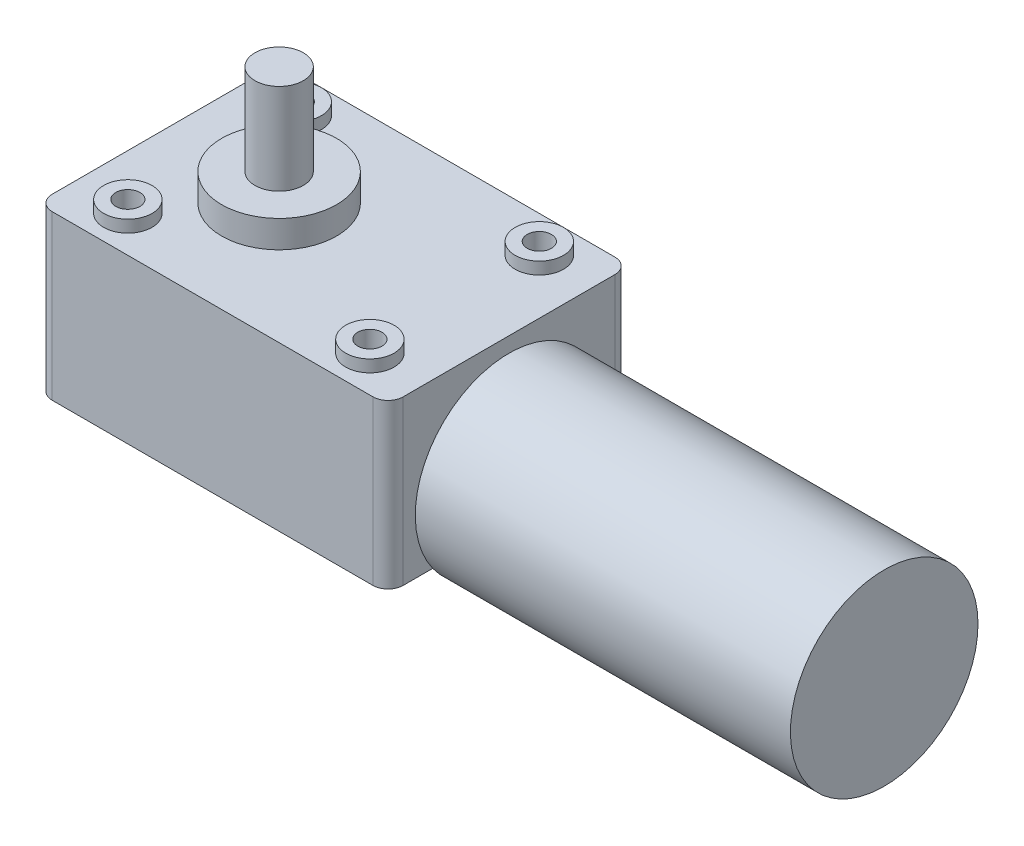
ISO-10303-21;
HEADER;
FILE_DESCRIPTION(('STEP AP214'),'2;1');
FILE_NAME('part.step','',(''),(''),'','','');
FILE_SCHEMA(('AUTOMOTIVE_DESIGN { 1 0 10303 214 1 1 1 1 }'));
ENDSEC;
DATA;
#1=APPLICATION_CONTEXT('core data for automotive mechanical design processes');
#2=APPLICATION_PROTOCOL_DEFINITION('international standard','automotive_design',2000,#1);
#3=PRODUCT_CONTEXT('',#1,'mechanical');
#4=PRODUCT('Part','Part','',(#3));
#5=PRODUCT_RELATED_PRODUCT_CATEGORY('part','',(#4));
#6=PRODUCT_DEFINITION_FORMATION('','',#4);
#7=PRODUCT_DEFINITION_CONTEXT('part definition',#1,'design');
#8=PRODUCT_DEFINITION('design','',#6,#7);
#9=PRODUCT_DEFINITION_SHAPE('','',#8);
#10=(LENGTH_UNIT() NAMED_UNIT(*) SI_UNIT(.MILLI.,.METRE.));
#11=(NAMED_UNIT(*) PLANE_ANGLE_UNIT() SI_UNIT($,.RADIAN.));
#12=(NAMED_UNIT(*) SI_UNIT($,.STERADIAN.) SOLID_ANGLE_UNIT());
#13=UNCERTAINTY_MEASURE_WITH_UNIT(LENGTH_MEASURE(1.E-05),#10,'distance_accuracy_value','');
#14=(GEOMETRIC_REPRESENTATION_CONTEXT(3) GLOBAL_UNCERTAINTY_ASSIGNED_CONTEXT((#13)) GLOBAL_UNIT_ASSIGNED_CONTEXT((#10,
#11,#12)) REPRESENTATION_CONTEXT('',''));
#15=CARTESIAN_POINT('',(0.,0.,0.));
#16=DIRECTION('',(0.,0.,1.));
#17=DIRECTION('',(1.,0.,0.));
#18=AXIS2_PLACEMENT_3D('',#15,#16,#17);
#19=CARTESIAN_POINT('',(-20.,-15.5,14.));
#20=DIRECTION('',(0.,-1.,0.));
#21=DIRECTION('',(0.,0.,1.));
#22=AXIS2_PLACEMENT_3D('',#19,#20,#21);
#23=PLANE('',#22);
#24=CARTESIAN_POINT('',(-20.,-15.5,14.));
#25=DIRECTION('',(0.,1.,0.));
#26=DIRECTION('',(0.,0.,1.));
#27=AXIS2_PLACEMENT_3D('',#24,#25,#26);
#28=CIRCLE('',#27,4.);
#29=CARTESIAN_POINT('',(-20.,-15.5,18.));
#30=VERTEX_POINT('',#29);
#31=EDGE_CURVE('E812',#30,#30,#28,.T.);
#32=ORIENTED_EDGE('',*,*,#31,.F.);
#33=EDGE_LOOP('',(#32));
#34=FACE_BOUND('',#33,.T.);
#35=CARTESIAN_POINT('',(-20.,-15.5,14.));
#36=DIRECTION('',(0.,1.,0.));
#37=DIRECTION('',(0.,0.,1.));
#38=AXIS2_PLACEMENT_3D('',#35,#36,#37);
#39=CIRCLE('',#38,2.);
#40=CARTESIAN_POINT('',(-20.,-15.5,16.));
#41=VERTEX_POINT('',#40);
#42=EDGE_CURVE('E840',#41,#41,#39,.T.);
#43=ORIENTED_EDGE('',*,*,#42,.T.);
#44=EDGE_LOOP('',(#43));
#45=FACE_BOUND('',#44,.T.);
#46=ADVANCED_FACE('F34',(#34,#45),#23,.T.);
#47=CARTESIAN_POINT('',(20.,-15.5,14.));
#48=DIRECTION('',(0.,-1.,0.));
#49=DIRECTION('',(0.,0.,1.));
#50=AXIS2_PLACEMENT_3D('',#47,#48,#49);
#51=PLANE('',#50);
#52=CARTESIAN_POINT('',(20.,-15.5,14.));
#53=DIRECTION('',(0.,1.,0.));
#54=DIRECTION('',(0.,0.,1.));
#55=AXIS2_PLACEMENT_3D('',#52,#53,#54);
#56=CIRCLE('',#55,4.);
#57=CARTESIAN_POINT('',(20.,-15.5,18.));
#58=VERTEX_POINT('',#57);
#59=EDGE_CURVE('E806',#58,#58,#56,.T.);
#60=ORIENTED_EDGE('',*,*,#59,.F.);
#61=EDGE_LOOP('',(#60));
#62=FACE_BOUND('',#61,.T.);
#63=CARTESIAN_POINT('',(20.,-15.5,14.));
#64=DIRECTION('',(0.,1.,0.));
#65=DIRECTION('',(0.,0.,1.));
#66=AXIS2_PLACEMENT_3D('',#63,#64,#65);
#67=CIRCLE('',#66,2.);
#68=CARTESIAN_POINT('',(20.,-15.5,16.));
#69=VERTEX_POINT('',#68);
#70=EDGE_CURVE('E792',#69,#69,#67,.T.);
#71=ORIENTED_EDGE('',*,*,#70,.T.);
#72=EDGE_LOOP('',(#71));
#73=FACE_BOUND('',#72,.T.);
#74=ADVANCED_FACE('F276',(#62,#73),#51,.T.);
#75=CARTESIAN_POINT('',(20.,-15.5,-14.));
#76=DIRECTION('',(0.,-1.,0.));
#77=DIRECTION('',(0.,0.,1.));
#78=AXIS2_PLACEMENT_3D('',#75,#76,#77);
#79=PLANE('',#78);
#80=CARTESIAN_POINT('',(20.,-15.5,-14.));
#81=DIRECTION('',(0.,1.,0.));
#82=DIRECTION('',(0.,0.,1.));
#83=AXIS2_PLACEMENT_3D('',#80,#81,#82);
#84=CIRCLE('',#83,4.);
#85=CARTESIAN_POINT('',(20.,-15.5,-10.));
#86=VERTEX_POINT('',#85);
#87=EDGE_CURVE('E780',#86,#86,#84,.T.);
#88=ORIENTED_EDGE('',*,*,#87,.F.);
#89=EDGE_LOOP('',(#88));
#90=FACE_BOUND('',#89,.T.);
#91=CARTESIAN_POINT('',(20.,-15.5,-14.));
#92=DIRECTION('',(0.,1.,0.));
#93=DIRECTION('',(0.,0.,1.));
#94=AXIS2_PLACEMENT_3D('',#91,#92,#93);
#95=CIRCLE('',#94,2.);
#96=CARTESIAN_POINT('',(20.,-15.5,-12.));
#97=VERTEX_POINT('',#96);
#98=EDGE_CURVE('E783',#97,#97,#95,.T.);
#99=ORIENTED_EDGE('',*,*,#98,.T.);
#100=EDGE_LOOP('',(#99));
#101=FACE_BOUND('',#100,.T.);
#102=ADVANCED_FACE('F282',(#90,#101),#79,.T.);
#103=CARTESIAN_POINT('',(-20.,-15.5,-13.9999999999999));
#104=DIRECTION('',(0.,-1.,0.));
#105=DIRECTION('',(0.,0.,1.));
#106=AXIS2_PLACEMENT_3D('',#103,#104,#105);
#107=PLANE('',#106);
#108=CARTESIAN_POINT('',(-20.,-15.5,-13.9999999999999));
#109=DIRECTION('',(0.,1.,0.));
#110=DIRECTION('',(0.,0.,1.));
#111=AXIS2_PLACEMENT_3D('',#108,#109,#110);
#112=CIRCLE('',#111,4.);
#113=CARTESIAN_POINT('',(-20.,-15.5,-9.9999999999999));
#114=VERTEX_POINT('',#113);
#115=EDGE_CURVE('E188',#114,#114,#112,.T.);
#116=ORIENTED_EDGE('',*,*,#115,.F.);
#117=EDGE_LOOP('',(#116));
#118=FACE_BOUND('',#117,.T.);
#119=CARTESIAN_POINT('',(-20.,-15.5,-13.9999999999999));
#120=DIRECTION('',(0.,1.,0.));
#121=DIRECTION('',(0.,0.,1.));
#122=AXIS2_PLACEMENT_3D('',#119,#120,#121);
#123=CIRCLE('',#122,2.);
#124=CARTESIAN_POINT('',(-20.,-15.5,-11.9999999999999));
#125=VERTEX_POINT('',#124);
#126=EDGE_CURVE('E789',#125,#125,#123,.T.);
#127=ORIENTED_EDGE('',*,*,#126,.T.);
#128=EDGE_LOOP('',(#127));
#129=FACE_BOUND('',#128,.T.);
#130=ADVANCED_FACE('F295',(#118,#129),#107,.T.);
#131=CARTESIAN_POINT('',(29.,13.5,17.5));
#132=DIRECTION('',(-1.,0.,0.));
#133=DIRECTION('',(0.,0.,1.));
#134=AXIS2_PLACEMENT_3D('',#131,#132,#133);
#135=PLANE('',#134);
#136=CARTESIAN_POINT('',(29.,-4.49999999999995,0.));
#137=DIRECTION('',(1.,0.,0.));
#138=DIRECTION('',(0.,0.,-1.));
#139=AXIS2_PLACEMENT_3D('',#136,#137,#138);
#140=CIRCLE('',#139,15.5);
#141=CARTESIAN_POINT('',(29.,-13.5,-12.6194294641239));
#142=VERTEX_POINT('',#141);
#143=CARTESIAN_POINT('',(29.,-13.5,12.6194294641239));
#144=VERTEX_POINT('',#143);
#145=EDGE_CURVE('E181',#142,#144,#140,.T.);
#146=ORIENTED_EDGE('',*,*,#145,.F.);
#147=DIRECTION('',(0.,0.,-1.));
#148=VECTOR('',#147,1.);
#149=CARTESIAN_POINT('',(29.,-13.5,17.5));
#150=LINE('',#149,#148);
#151=CARTESIAN_POINT('',(29.,-13.5,-17.5));
#152=VERTEX_POINT('',#151);
#153=EDGE_CURVE('E150',#142,#152,#150,.T.);
#154=ORIENTED_EDGE('',*,*,#153,.T.);
#155=DIRECTION('',(0.,-1.,0.));
#156=VECTOR('',#155,1.);
#157=CARTESIAN_POINT('',(29.,13.5,-17.5));
#158=LINE('',#157,#156);
#159=CARTESIAN_POINT('',(29.,13.5,-17.5));
#160=VERTEX_POINT('',#159);
#161=EDGE_CURVE('E163',#160,#152,#158,.T.);
#162=ORIENTED_EDGE('',*,*,#161,.F.);
#163=DIRECTION('',(0.,0.,-1.));
#164=VECTOR('',#163,1.);
#165=CARTESIAN_POINT('',(29.,13.5,17.5));
#166=LINE('',#165,#164);
#167=CARTESIAN_POINT('',(29.,13.5,17.5));
#168=VERTEX_POINT('',#167);
#169=EDGE_CURVE('E259',#168,#160,#166,.T.);
#170=ORIENTED_EDGE('',*,*,#169,.F.);
#171=DIRECTION('',(0.,-1.,0.));
#172=VECTOR('',#171,1.);
#173=CARTESIAN_POINT('',(29.,13.5,17.5));
#174=LINE('',#173,#172);
#175=CARTESIAN_POINT('',(29.,-13.5,17.5));
#176=VERTEX_POINT('',#175);
#177=EDGE_CURVE('E166',#168,#176,#174,.T.);
#178=ORIENTED_EDGE('',*,*,#177,.T.);
#179=EDGE_CURVE('E151',#176,#144,#150,.T.);
#180=ORIENTED_EDGE('',*,*,#179,.T.);
#181=EDGE_LOOP('',(#146,#154,#162,#170,#178,#180));
#182=FACE_BOUND('',#181,.T.);
#183=ADVANCED_FACE('F180',(#182),#135,.F.);
#184=CARTESIAN_POINT('',(-9.00000000000001,18.,0.));
#185=DIRECTION('',(0.,1.,0.));
#186=DIRECTION('',(0.,0.,1.));
#187=AXIS2_PLACEMENT_3D('',#184,#185,#186);
#188=PLANE('',#187);
#189=CARTESIAN_POINT('',(-9.00000000000001,18.,0.));
#190=DIRECTION('',(0.,1.,0.));
#191=DIRECTION('',(0.,0.,1.));
#192=AXIS2_PLACEMENT_3D('',#189,#190,#191);
#193=CIRCLE('',#192,9.5);
#194=CARTESIAN_POINT('',(-9.00000000000001,18.,9.5));
#195=VERTEX_POINT('',#194);
#196=EDGE_CURVE('E204',#195,#195,#193,.T.);
#197=ORIENTED_EDGE('',*,*,#196,.T.);
#198=EDGE_LOOP('',(#197));
#199=FACE_BOUND('',#198,.T.);
#200=CARTESIAN_POINT('',(-9.00000000000001,18.,0.));
#201=DIRECTION('',(0.,1.,0.));
#202=DIRECTION('',(0.,0.,1.));
#203=AXIS2_PLACEMENT_3D('',#200,#201,#202);
#204=CIRCLE('',#203,4.);
#205=CARTESIAN_POINT('',(-9.00000000000001,18.,4.));
#206=VERTEX_POINT('',#205);
#207=EDGE_CURVE('E194',#206,#206,#204,.T.);
#208=ORIENTED_EDGE('',*,*,#207,.F.);
#209=EDGE_LOOP('',(#208));
#210=FACE_BOUND('',#209,.T.);
#211=ADVANCED_FACE('F320',(#199,#210),#188,.T.);
#212=CARTESIAN_POINT('',(-26.5,13.5,17.5));
#213=DIRECTION('',(0.,1.,0.));
#214=DIRECTION('',(0.,0.,1.));
#215=AXIS2_PLACEMENT_3D('',#212,#213,#214);
#216=PLANE('',#215);
#217=CARTESIAN_POINT('',(20.,13.5,-14.));
#218=DIRECTION('',(0.,1.,0.));
#219=DIRECTION('',(0.,0.,1.));
#220=AXIS2_PLACEMENT_3D('',#217,#218,#219);
#221=CIRCLE('',#220,4.);
#222=CARTESIAN_POINT('',(20.,13.5,-10.));
#223=VERTEX_POINT('',#222);
#224=EDGE_CURVE('E231',#223,#223,#221,.T.);
#225=ORIENTED_EDGE('',*,*,#224,.F.);
#226=EDGE_LOOP('',(#225));
#227=FACE_BOUND('',#226,.T.);
#228=CARTESIAN_POINT('',(-20.,13.5,14.));
#229=DIRECTION('',(0.,1.,0.));
#230=DIRECTION('',(0.,0.,1.));
#231=AXIS2_PLACEMENT_3D('',#228,#229,#230);
#232=CIRCLE('',#231,4.);
#233=CARTESIAN_POINT('',(-20.,13.5,18.));
#234=VERTEX_POINT('',#233);
#235=EDGE_CURVE('E243',#234,#234,#232,.T.);
#236=ORIENTED_EDGE('',*,*,#235,.F.);
#237=EDGE_LOOP('',(#236));
#238=FACE_BOUND('',#237,.T.);
#239=CARTESIAN_POINT('',(-26.5,13.5,17.5));
#240=DIRECTION('',(0.,1.,0.));
#241=DIRECTION('',(0.,0.,1.));
#242=AXIS2_PLACEMENT_3D('',#239,#240,#241);
#243=CIRCLE('',#242,2.5);
#244=CARTESIAN_POINT('',(-29.,13.5,17.5));
#245=VERTEX_POINT('',#244);
#246=CARTESIAN_POINT('',(-26.5,13.5,20.));
#247=VERTEX_POINT('',#246);
#248=EDGE_CURVE('E159',#245,#247,#243,.T.);
#249=ORIENTED_EDGE('',*,*,#248,.T.);
#250=DIRECTION('',(1.,0.,0.));
#251=VECTOR('',#250,1.);
#252=CARTESIAN_POINT('',(-26.5,13.5,20.));
#253=LINE('',#252,#251);
#254=CARTESIAN_POINT('',(26.5,13.5,20.));
#255=VERTEX_POINT('',#254);
#256=EDGE_CURVE('E99',#247,#255,#253,.T.);
#257=ORIENTED_EDGE('',*,*,#256,.T.);
#258=CARTESIAN_POINT('',(26.5,13.5,17.5));
#259=DIRECTION('',(0.,1.,0.));
#260=DIRECTION('',(0.,0.,1.));
#261=AXIS2_PLACEMENT_3D('',#258,#259,#260);
#262=CIRCLE('',#261,2.5);
#263=EDGE_CURVE('E174',#255,#168,#262,.T.);
#264=ORIENTED_EDGE('',*,*,#263,.T.);
#265=ORIENTED_EDGE('',*,*,#169,.T.);
#266=CARTESIAN_POINT('',(26.5,13.5,-17.5));
#267=DIRECTION('',(0.,1.,0.));
#268=DIRECTION('',(0.,0.,1.));
#269=AXIS2_PLACEMENT_3D('',#266,#267,#268);
#270=CIRCLE('',#269,2.49999999999999);
#271=CARTESIAN_POINT('',(26.5,13.5,-20.));
#272=VERTEX_POINT('',#271);
#273=EDGE_CURVE('E121',#160,#272,#270,.T.);
#274=ORIENTED_EDGE('',*,*,#273,.T.);
#275=DIRECTION('',(-1.,0.,0.));
#276=VECTOR('',#275,1.);
#277=CARTESIAN_POINT('',(-26.5,13.5,-20.));
#278=LINE('',#277,#276);
#279=CARTESIAN_POINT('',(-26.5,13.5,-20.));
#280=VERTEX_POINT('',#279);
#281=EDGE_CURVE('E113',#272,#280,#278,.T.);
#282=ORIENTED_EDGE('',*,*,#281,.T.);
#283=CARTESIAN_POINT('',(-26.5,13.5,-17.5));
#284=DIRECTION('',(0.,1.,0.));
#285=DIRECTION('',(0.,0.,-1.));
#286=AXIS2_PLACEMENT_3D('',#283,#284,#285);
#287=CIRCLE('',#286,2.5);
#288=CARTESIAN_POINT('',(-29.,13.5,-17.5));
#289=VERTEX_POINT('',#288);
#290=EDGE_CURVE('E118',#280,#289,#287,.T.);
#291=ORIENTED_EDGE('',*,*,#290,.T.);
#292=DIRECTION('',(0.,0.,1.));
#293=VECTOR('',#292,1.);
#294=CARTESIAN_POINT('',(-29.,13.5,17.5));
#295=LINE('',#294,#293);
#296=EDGE_CURVE('E58',#289,#245,#295,.T.);
#297=ORIENTED_EDGE('',*,*,#296,.T.);
#298=EDGE_LOOP('',(#249,#257,#264,#265,#274,#282,#291,#297));
#299=FACE_BOUND('',#298,.T.);
#300=CARTESIAN_POINT('',(-20.,13.5,-13.9999999999999));
#301=DIRECTION('',(0.,1.,0.));
#302=DIRECTION('',(0.,0.,1.));
#303=AXIS2_PLACEMENT_3D('',#300,#301,#302);
#304=CIRCLE('',#303,4.);
#305=CARTESIAN_POINT('',(-20.,13.5,-9.9999999999999));
#306=VERTEX_POINT('',#305);
#307=EDGE_CURVE('E249',#306,#306,#304,.T.);
#308=ORIENTED_EDGE('',*,*,#307,.F.);
#309=EDGE_LOOP('',(#308));
#310=FACE_BOUND('',#309,.T.);
#311=CARTESIAN_POINT('',(20.,13.5,14.));
#312=DIRECTION('',(0.,1.,0.));
#313=DIRECTION('',(0.,0.,1.));
#314=AXIS2_PLACEMENT_3D('',#311,#312,#313);
#315=CIRCLE('',#314,4.);
#316=CARTESIAN_POINT('',(20.,13.5,18.));
#317=VERTEX_POINT('',#316);
#318=EDGE_CURVE('E237',#317,#317,#315,.T.);
#319=ORIENTED_EDGE('',*,*,#318,.F.);
#320=EDGE_LOOP('',(#319));
#321=FACE_BOUND('',#320,.T.);
#322=CARTESIAN_POINT('',(-9.00000000000001,13.5,0.));
#323=DIRECTION('',(0.,1.,0.));
#324=DIRECTION('',(0.,0.,1.));
#325=AXIS2_PLACEMENT_3D('',#322,#323,#324);
#326=CIRCLE('',#325,9.5);
#327=CARTESIAN_POINT('',(-9.00000000000001,13.5,9.5));
#328=VERTEX_POINT('',#327);
#329=EDGE_CURVE('E201',#328,#328,#326,.T.);
#330=ORIENTED_EDGE('',*,*,#329,.F.);
#331=EDGE_LOOP('',(#330));
#332=FACE_BOUND('',#331,.T.);
#333=ADVANCED_FACE('F115',(#227,#238,#299,#310,#321,#332),#216,.T.);
#334=CARTESIAN_POINT('',(-26.5,13.5,17.5));
#335=DIRECTION('',(0.,-1.,0.));
#336=DIRECTION('',(0.,0.,-1.));
#337=AXIS2_PLACEMENT_3D('',#334,#335,#336);
#338=CYLINDRICAL_SURFACE('',#337,2.5);
#339=CARTESIAN_POINT('',(-26.5,-13.5,17.5));
#340=DIRECTION('',(0.,1.,0.));
#341=DIRECTION('',(0.,0.,1.));
#342=AXIS2_PLACEMENT_3D('',#339,#340,#341);
#343=CIRCLE('',#342,2.5);
#344=CARTESIAN_POINT('',(-29.,-13.5,17.5));
#345=VERTEX_POINT('',#344);
#346=CARTESIAN_POINT('',(-26.5,-13.5,20.));
#347=VERTEX_POINT('',#346);
#348=EDGE_CURVE('E142',#345,#347,#343,.T.);
#349=ORIENTED_EDGE('',*,*,#348,.T.);
#350=DIRECTION('',(0.,-1.,0.));
#351=VECTOR('',#350,1.);
#352=CARTESIAN_POINT('',(-26.5,13.5,20.));
#353=LINE('',#352,#351);
#354=EDGE_CURVE('E11',#247,#347,#353,.T.);
#355=ORIENTED_EDGE('',*,*,#354,.F.);
#356=ORIENTED_EDGE('',*,*,#248,.F.);
#357=DIRECTION('',(0.,-1.,0.));
#358=VECTOR('',#357,1.);
#359=CARTESIAN_POINT('',(-29.,13.5,17.5));
#360=LINE('',#359,#358);
#361=EDGE_CURVE('E138',#245,#345,#360,.T.);
#362=ORIENTED_EDGE('',*,*,#361,.T.);
#363=EDGE_LOOP('',(#349,#355,#356,#362));
#364=FACE_BOUND('',#363,.T.);
#365=ADVANCED_FACE('F36',(#364),#338,.T.);
#366=CARTESIAN_POINT('',(-26.5,13.5,20.));
#367=DIRECTION('',(0.,0.,-1.));
#368=DIRECTION('',(-1.,0.,0.));
#369=AXIS2_PLACEMENT_3D('',#366,#367,#368);
#370=PLANE('',#369);
#371=DIRECTION('',(1.,0.,0.));
#372=VECTOR('',#371,1.);
#373=CARTESIAN_POINT('',(-26.5,-13.5,20.));
#374=LINE('',#373,#372);
#375=CARTESIAN_POINT('',(26.5,-13.5,20.));
#376=VERTEX_POINT('',#375);
#377=EDGE_CURVE('E145',#347,#376,#374,.T.);
#378=ORIENTED_EDGE('',*,*,#377,.T.);
#379=DIRECTION('',(0.,-1.,0.));
#380=VECTOR('',#379,1.);
#381=CARTESIAN_POINT('',(26.5,13.5,20.));
#382=LINE('',#381,#380);
#383=EDGE_CURVE('E42',#255,#376,#382,.T.);
#384=ORIENTED_EDGE('',*,*,#383,.F.);
#385=ORIENTED_EDGE('',*,*,#256,.F.);
#386=ORIENTED_EDGE('',*,*,#354,.T.);
#387=EDGE_LOOP('',(#378,#384,#385,#386));
#388=FACE_BOUND('',#387,.T.);
#389=ADVANCED_FACE('F268',(#388),#370,.F.);
#390=CARTESIAN_POINT('',(26.5,13.5,17.5));
#391=DIRECTION('',(0.,-1.,0.));
#392=DIRECTION('',(0.,0.,-1.));
#393=AXIS2_PLACEMENT_3D('',#390,#391,#392);
#394=CYLINDRICAL_SURFACE('',#393,2.5);
#395=CARTESIAN_POINT('',(26.5,-13.5,17.5));
#396=DIRECTION('',(0.,1.,0.));
#397=DIRECTION('',(0.,0.,1.));
#398=AXIS2_PLACEMENT_3D('',#395,#396,#397);
#399=CIRCLE('',#398,2.5);
#400=EDGE_CURVE('E148',#376,#176,#399,.T.);
#401=ORIENTED_EDGE('',*,*,#400,.T.);
#402=ORIENTED_EDGE('',*,*,#177,.F.);
#403=ORIENTED_EDGE('',*,*,#263,.F.);
#404=ORIENTED_EDGE('',*,*,#383,.T.);
#405=EDGE_LOOP('',(#401,#402,#403,#404));
#406=FACE_BOUND('',#405,.T.);
#407=ADVANCED_FACE('F172',(#406),#394,.T.);
#408=CARTESIAN_POINT('',(26.5,13.5,-17.5));
#409=DIRECTION('',(0.,-1.,0.));
#410=DIRECTION('',(0.,0.,-1.));
#411=AXIS2_PLACEMENT_3D('',#408,#409,#410);
#412=CYLINDRICAL_SURFACE('',#411,2.49999999999999);
#413=CARTESIAN_POINT('',(26.5,-13.5,-17.5));
#414=DIRECTION('',(0.,1.,0.));
#415=DIRECTION('',(0.,0.,1.));
#416=AXIS2_PLACEMENT_3D('',#413,#414,#415);
#417=CIRCLE('',#416,2.49999999999999);
#418=CARTESIAN_POINT('',(26.5,-13.5,-20.));
#419=VERTEX_POINT('',#418);
#420=EDGE_CURVE('E153',#152,#419,#417,.T.);
#421=ORIENTED_EDGE('',*,*,#420,.T.);
#422=DIRECTION('',(0.,-1.,0.));
#423=VECTOR('',#422,1.);
#424=CARTESIAN_POINT('',(26.5,13.5,-20.));
#425=LINE('',#424,#423);
#426=EDGE_CURVE('E133',#272,#419,#425,.T.);
#427=ORIENTED_EDGE('',*,*,#426,.F.);
#428=ORIENTED_EDGE('',*,*,#273,.F.);
#429=ORIENTED_EDGE('',*,*,#161,.T.);
#430=EDGE_LOOP('',(#421,#427,#428,#429));
#431=FACE_BOUND('',#430,.T.);
#432=ADVANCED_FACE('F263',(#431),#412,.T.);
#433=CARTESIAN_POINT('',(-26.5,13.5,-20.));
#434=DIRECTION('',(0.,0.,1.));
#435=DIRECTION('',(1.,0.,0.));
#436=AXIS2_PLACEMENT_3D('',#433,#434,#435);
#437=PLANE('',#436);
#438=DIRECTION('',(-1.,0.,0.));
#439=VECTOR('',#438,1.);
#440=CARTESIAN_POINT('',(-26.5,-13.5,-20.));
#441=LINE('',#440,#439);
#442=CARTESIAN_POINT('',(-26.5,-13.5,-20.));
#443=VERTEX_POINT('',#442);
#444=EDGE_CURVE('E130',#419,#443,#441,.T.);
#445=ORIENTED_EDGE('',*,*,#444,.T.);
#446=DIRECTION('',(0.,-1.,0.));
#447=VECTOR('',#446,1.);
#448=CARTESIAN_POINT('',(-26.5,13.5,-20.));
#449=LINE('',#448,#447);
#450=EDGE_CURVE('E127',#280,#443,#449,.T.);
#451=ORIENTED_EDGE('',*,*,#450,.F.);
#452=ORIENTED_EDGE('',*,*,#281,.F.);
#453=ORIENTED_EDGE('',*,*,#426,.T.);
#454=EDGE_LOOP('',(#445,#451,#452,#453));
#455=FACE_BOUND('',#454,.T.);
#456=ADVANCED_FACE('F128',(#455),#437,.F.);
#457=CARTESIAN_POINT('',(-26.5,13.5,-17.5));
#458=DIRECTION('',(0.,-1.,0.));
#459=DIRECTION('',(0.,0.,-1.));
#460=AXIS2_PLACEMENT_3D('',#457,#458,#459);
#461=CYLINDRICAL_SURFACE('',#460,2.5);
#462=CARTESIAN_POINT('',(-26.5,-13.5,-17.5));
#463=DIRECTION('',(0.,1.,0.));
#464=DIRECTION('',(0.,0.,-1.));
#465=AXIS2_PLACEMENT_3D('',#462,#463,#464);
#466=CIRCLE('',#465,2.5);
#467=CARTESIAN_POINT('',(-29.,-13.5,-17.5));
#468=VERTEX_POINT('',#467);
#469=EDGE_CURVE('E156',#443,#468,#466,.T.);
#470=ORIENTED_EDGE('',*,*,#469,.T.);
#471=DIRECTION('',(0.,-1.,0.));
#472=VECTOR('',#471,1.);
#473=CARTESIAN_POINT('',(-29.,13.5,-17.5));
#474=LINE('',#473,#472);
#475=EDGE_CURVE('E134',#289,#468,#474,.T.);
#476=ORIENTED_EDGE('',*,*,#475,.F.);
#477=ORIENTED_EDGE('',*,*,#290,.F.);
#478=ORIENTED_EDGE('',*,*,#450,.T.);
#479=EDGE_LOOP('',(#470,#476,#477,#478));
#480=FACE_BOUND('',#479,.T.);
#481=ADVANCED_FACE('F136',(#480),#461,.T.);
#482=CARTESIAN_POINT('',(-29.,13.5,17.5));
#483=DIRECTION('',(1.,0.,0.));
#484=DIRECTION('',(0.,0.,-1.));
#485=AXIS2_PLACEMENT_3D('',#482,#483,#484);
#486=PLANE('',#485);
#487=DIRECTION('',(0.,0.,1.));
#488=VECTOR('',#487,1.);
#489=CARTESIAN_POINT('',(-29.,-13.5,17.5));
#490=LINE('',#489,#488);
#491=EDGE_CURVE('E91',#468,#345,#490,.T.);
#492=ORIENTED_EDGE('',*,*,#491,.T.);
#493=ORIENTED_EDGE('',*,*,#361,.F.);
#494=ORIENTED_EDGE('',*,*,#296,.F.);
#495=ORIENTED_EDGE('',*,*,#475,.T.);
#496=EDGE_LOOP('',(#492,#493,#494,#495));
#497=FACE_BOUND('',#496,.T.);
#498=ADVANCED_FACE('F264',(#497),#486,.F.);
#499=CARTESIAN_POINT('',(-26.5,-13.5,17.5));
#500=DIRECTION('',(0.,1.,0.));
#501=DIRECTION('',(0.,0.,1.));
#502=AXIS2_PLACEMENT_3D('',#499,#500,#501);
#503=PLANE('',#502);
#504=CARTESIAN_POINT('',(-9.00000000000001,-13.5,0.));
#505=DIRECTION('',(0.,1.,0.));
#506=DIRECTION('',(0.,0.,1.));
#507=AXIS2_PLACEMENT_3D('',#504,#505,#506);
#508=CIRCLE('',#507,9.5);
#509=CARTESIAN_POINT('',(-9.00000000000001,-13.5,9.5));
#510=VERTEX_POINT('',#509);
#511=EDGE_CURVE('E846',#510,#510,#508,.T.);
#512=ORIENTED_EDGE('',*,*,#511,.T.);
#513=EDGE_LOOP('',(#512));
#514=FACE_BOUND('',#513,.T.);
#515=CARTESIAN_POINT('',(20.,-13.5,-14.));
#516=DIRECTION('',(0.,1.,0.));
#517=DIRECTION('',(0.,0.,1.));
#518=AXIS2_PLACEMENT_3D('',#515,#516,#517);
#519=CIRCLE('',#518,4.);
#520=CARTESIAN_POINT('',(20.,-13.5,-10.));
#521=VERTEX_POINT('',#520);
#522=EDGE_CURVE('E799',#521,#521,#519,.T.);
#523=ORIENTED_EDGE('',*,*,#522,.T.);
#524=EDGE_LOOP('',(#523));
#525=FACE_BOUND('',#524,.T.);
#526=CARTESIAN_POINT('',(20.,-13.5,14.));
#527=DIRECTION('',(0.,1.,0.));
#528=DIRECTION('',(0.,0.,1.));
#529=AXIS2_PLACEMENT_3D('',#526,#527,#528);
#530=CIRCLE('',#529,4.);
#531=CARTESIAN_POINT('',(20.,-13.5,18.));
#532=VERTEX_POINT('',#531);
#533=EDGE_CURVE('E803',#532,#532,#530,.T.);
#534=ORIENTED_EDGE('',*,*,#533,.T.);
#535=EDGE_LOOP('',(#534));
#536=FACE_BOUND('',#535,.T.);
#537=CARTESIAN_POINT('',(-20.,-13.5,14.));
#538=DIRECTION('',(0.,1.,0.));
#539=DIRECTION('',(0.,0.,1.));
#540=AXIS2_PLACEMENT_3D('',#537,#538,#539);
#541=CIRCLE('',#540,4.);
#542=CARTESIAN_POINT('',(-20.,-13.5,18.));
#543=VERTEX_POINT('',#542);
#544=EDGE_CURVE('E809',#543,#543,#541,.T.);
#545=ORIENTED_EDGE('',*,*,#544,.T.);
#546=EDGE_LOOP('',(#545));
#547=FACE_BOUND('',#546,.T.);
#548=CARTESIAN_POINT('',(-20.,-13.5,-13.9999999999999));
#549=DIRECTION('',(0.,1.,0.));
#550=DIRECTION('',(0.,0.,1.));
#551=AXIS2_PLACEMENT_3D('',#548,#549,#550);
#552=CIRCLE('',#551,4.);
#553=CARTESIAN_POINT('',(-20.,-13.5,-9.9999999999999));
#554=VERTEX_POINT('',#553);
#555=EDGE_CURVE('E815',#554,#554,#552,.T.);
#556=ORIENTED_EDGE('',*,*,#555,.T.);
#557=EDGE_LOOP('',(#556));
#558=FACE_BOUND('',#557,.T.);
#559=ORIENTED_EDGE('',*,*,#348,.F.);
#560=ORIENTED_EDGE('',*,*,#491,.F.);
#561=ORIENTED_EDGE('',*,*,#469,.F.);
#562=ORIENTED_EDGE('',*,*,#444,.F.);
#563=ORIENTED_EDGE('',*,*,#420,.F.);
#564=ORIENTED_EDGE('',*,*,#153,.F.);
#565=EDGE_CURVE('E49',#144,#142,#150,.T.);
#566=ORIENTED_EDGE('',*,*,#565,.F.);
#567=ORIENTED_EDGE('',*,*,#179,.F.);
#568=ORIENTED_EDGE('',*,*,#400,.F.);
#569=ORIENTED_EDGE('',*,*,#377,.F.);
#570=EDGE_LOOP('',(#559,#560,#561,#562,#563,#564,#566,#567,#568,#569));
#571=FACE_BOUND('',#570,.T.);
#572=ADVANCED_FACE('F176',(#514,#525,#536,#547,#558,#571),#503,.F.);
#573=CARTESIAN_POINT('',(-20.,15.5,-13.9999999999999));
#574=DIRECTION('',(0.,-1.,0.));
#575=DIRECTION('',(0.,0.,-1.));
#576=AXIS2_PLACEMENT_3D('',#573,#574,#575);
#577=CYLINDRICAL_SURFACE('',#576,4.);
#578=CARTESIAN_POINT('',(-20.,15.5,-13.9999999999999));
#579=DIRECTION('',(0.,1.,0.));
#580=DIRECTION('',(0.,0.,1.));
#581=AXIS2_PLACEMENT_3D('',#578,#579,#580);
#582=CIRCLE('',#581,4.);
#583=CARTESIAN_POINT('',(-20.,15.5,-9.9999999999999));
#584=VERTEX_POINT('',#583);
#585=EDGE_CURVE('E146',#584,#584,#582,.T.);
#586=ORIENTED_EDGE('',*,*,#585,.F.);
#587=EDGE_LOOP('',(#586));
#588=FACE_BOUND('',#587,.T.);
#589=ORIENTED_EDGE('',*,*,#307,.T.);
#590=EDGE_LOOP('',(#589));
#591=FACE_BOUND('',#590,.T.);
#592=ADVANCED_FACE('F386',(#588,#591),#577,.T.);
#593=CARTESIAN_POINT('',(-20.,15.5,-13.9999999999999));
#594=DIRECTION('',(0.,1.,0.));
#595=DIRECTION('',(0.,0.,1.));
#596=AXIS2_PLACEMENT_3D('',#593,#594,#595);
#597=PLANE('',#596);
#598=CARTESIAN_POINT('',(-20.,15.5,-13.9999999999999));
#599=DIRECTION('',(0.,1.,0.));
#600=DIRECTION('',(0.,0.,1.));
#601=AXIS2_PLACEMENT_3D('',#598,#599,#600);
#602=CIRCLE('',#601,2.);
#603=CARTESIAN_POINT('',(-20.,15.5,-11.9999999999999));
#604=VERTEX_POINT('',#603);
#605=EDGE_CURVE('E225',#604,#604,#602,.T.);
#606=ORIENTED_EDGE('',*,*,#605,.F.);
#607=EDGE_LOOP('',(#606));
#608=FACE_BOUND('',#607,.T.);
#609=ORIENTED_EDGE('',*,*,#585,.T.);
#610=EDGE_LOOP('',(#609));
#611=FACE_BOUND('',#610,.T.);
#612=ADVANCED_FACE('F382',(#608,#611),#597,.T.);
#613=CARTESIAN_POINT('',(-20.,15.5,14.));
#614=DIRECTION('',(0.,-1.,0.));
#615=DIRECTION('',(0.,0.,-1.));
#616=AXIS2_PLACEMENT_3D('',#613,#614,#615);
#617=CYLINDRICAL_SURFACE('',#616,4.);
#618=CARTESIAN_POINT('',(-20.,15.5,14.));
#619=DIRECTION('',(0.,1.,0.));
#620=DIRECTION('',(0.,0.,1.));
#621=AXIS2_PLACEMENT_3D('',#618,#619,#620);
#622=CIRCLE('',#621,4.);
#623=CARTESIAN_POINT('',(-20.,15.5,18.));
#624=VERTEX_POINT('',#623);
#625=EDGE_CURVE('E246',#624,#624,#622,.T.);
#626=ORIENTED_EDGE('',*,*,#625,.F.);
#627=EDGE_LOOP('',(#626));
#628=FACE_BOUND('',#627,.T.);
#629=ORIENTED_EDGE('',*,*,#235,.T.);
#630=EDGE_LOOP('',(#629));
#631=FACE_BOUND('',#630,.T.);
#632=ADVANCED_FACE('F378',(#628,#631),#617,.T.);
#633=CARTESIAN_POINT('',(-20.,15.5,14.));
#634=DIRECTION('',(0.,1.,0.));
#635=DIRECTION('',(0.,0.,1.));
#636=AXIS2_PLACEMENT_3D('',#633,#634,#635);
#637=PLANE('',#636);
#638=CARTESIAN_POINT('',(-20.,15.5,14.));
#639=DIRECTION('',(0.,1.,0.));
#640=DIRECTION('',(0.,0.,1.));
#641=AXIS2_PLACEMENT_3D('',#638,#639,#640);
#642=CIRCLE('',#641,2.);
#643=CARTESIAN_POINT('',(-20.,15.5,16.));
#644=VERTEX_POINT('',#643);
#645=EDGE_CURVE('E207',#644,#644,#642,.T.);
#646=ORIENTED_EDGE('',*,*,#645,.F.);
#647=EDGE_LOOP('',(#646));
#648=FACE_BOUND('',#647,.T.);
#649=ORIENTED_EDGE('',*,*,#625,.T.);
#650=EDGE_LOOP('',(#649));
#651=FACE_BOUND('',#650,.T.);
#652=ADVANCED_FACE('F374',(#648,#651),#637,.T.);
#653=CARTESIAN_POINT('',(20.,15.5,14.));
#654=DIRECTION('',(0.,-1.,0.));
#655=DIRECTION('',(0.,0.,-1.));
#656=AXIS2_PLACEMENT_3D('',#653,#654,#655);
#657=CYLINDRICAL_SURFACE('',#656,4.);
#658=CARTESIAN_POINT('',(20.,15.5,14.));
#659=DIRECTION('',(0.,1.,0.));
#660=DIRECTION('',(0.,0.,1.));
#661=AXIS2_PLACEMENT_3D('',#658,#659,#660);
#662=CIRCLE('',#661,4.);
#663=CARTESIAN_POINT('',(20.,15.5,18.));
#664=VERTEX_POINT('',#663);
#665=EDGE_CURVE('E240',#664,#664,#662,.T.);
#666=ORIENTED_EDGE('',*,*,#665,.F.);
#667=EDGE_LOOP('',(#666));
#668=FACE_BOUND('',#667,.T.);
#669=ORIENTED_EDGE('',*,*,#318,.T.);
#670=EDGE_LOOP('',(#669));
#671=FACE_BOUND('',#670,.T.);
#672=ADVANCED_FACE('F370',(#668,#671),#657,.T.);
#673=CARTESIAN_POINT('',(20.,15.5,14.));
#674=DIRECTION('',(0.,1.,0.));
#675=DIRECTION('',(0.,0.,1.));
#676=AXIS2_PLACEMENT_3D('',#673,#674,#675);
#677=PLANE('',#676);
#678=CARTESIAN_POINT('',(20.,15.5,14.));
#679=DIRECTION('',(0.,1.,0.));
#680=DIRECTION('',(0.,0.,1.));
#681=AXIS2_PLACEMENT_3D('',#678,#679,#680);
#682=CIRCLE('',#681,2.);
#683=CARTESIAN_POINT('',(20.,15.5,16.));
#684=VERTEX_POINT('',#683);
#685=EDGE_CURVE('E213',#684,#684,#682,.T.);
#686=ORIENTED_EDGE('',*,*,#685,.F.);
#687=EDGE_LOOP('',(#686));
#688=FACE_BOUND('',#687,.T.);
#689=ORIENTED_EDGE('',*,*,#665,.T.);
#690=EDGE_LOOP('',(#689));
#691=FACE_BOUND('',#690,.T.);
#692=ADVANCED_FACE('F366',(#688,#691),#677,.T.);
#693=CARTESIAN_POINT('',(20.,15.5,-14.));
#694=DIRECTION('',(0.,-1.,0.));
#695=DIRECTION('',(0.,0.,-1.));
#696=AXIS2_PLACEMENT_3D('',#693,#694,#695);
#697=CYLINDRICAL_SURFACE('',#696,4.);
#698=CARTESIAN_POINT('',(20.,15.5,-14.));
#699=DIRECTION('',(0.,1.,0.));
#700=DIRECTION('',(0.,0.,1.));
#701=AXIS2_PLACEMENT_3D('',#698,#699,#700);
#702=CIRCLE('',#701,4.);
#703=CARTESIAN_POINT('',(20.,15.5,-10.));
#704=VERTEX_POINT('',#703);
#705=EDGE_CURVE('E234',#704,#704,#702,.T.);
#706=ORIENTED_EDGE('',*,*,#705,.F.);
#707=EDGE_LOOP('',(#706));
#708=FACE_BOUND('',#707,.T.);
#709=ORIENTED_EDGE('',*,*,#224,.T.);
#710=EDGE_LOOP('',(#709));
#711=FACE_BOUND('',#710,.T.);
#712=ADVANCED_FACE('F362',(#708,#711),#697,.T.);
#713=CARTESIAN_POINT('',(20.,15.5,-14.));
#714=DIRECTION('',(0.,1.,0.));
#715=DIRECTION('',(0.,0.,1.));
#716=AXIS2_PLACEMENT_3D('',#713,#714,#715);
#717=PLANE('',#716);
#718=CARTESIAN_POINT('',(20.,15.5,-14.));
#719=DIRECTION('',(0.,1.,0.));
#720=DIRECTION('',(0.,0.,1.));
#721=AXIS2_PLACEMENT_3D('',#718,#719,#720);
#722=CIRCLE('',#721,2.);
#723=CARTESIAN_POINT('',(20.,15.5,-12.));
#724=VERTEX_POINT('',#723);
#725=EDGE_CURVE('E219',#724,#724,#722,.T.);
#726=ORIENTED_EDGE('',*,*,#725,.F.);
#727=EDGE_LOOP('',(#726));
#728=FACE_BOUND('',#727,.T.);
#729=ORIENTED_EDGE('',*,*,#705,.T.);
#730=EDGE_LOOP('',(#729));
#731=FACE_BOUND('',#730,.T.);
#732=ADVANCED_FACE('F358',(#728,#731),#717,.T.);
#733=CARTESIAN_POINT('',(-20.,9.5,-13.9999999999999));
#734=DIRECTION('',(0.,1.,0.));
#735=DIRECTION('',(0.,0.,1.));
#736=AXIS2_PLACEMENT_3D('',#733,#734,#735);
#737=CYLINDRICAL_SURFACE('',#736,2.);
#738=CARTESIAN_POINT('',(-20.,9.5,-13.9999999999999));
#739=DIRECTION('',(0.,1.,0.));
#740=DIRECTION('',(0.,0.,1.));
#741=AXIS2_PLACEMENT_3D('',#738,#739,#740);
#742=CIRCLE('',#741,2.);
#743=CARTESIAN_POINT('',(-20.,9.5,-11.9999999999999));
#744=VERTEX_POINT('',#743);
#745=EDGE_CURVE('E228',#744,#744,#742,.T.);
#746=ORIENTED_EDGE('',*,*,#745,.F.);
#747=EDGE_LOOP('',(#746));
#748=FACE_BOUND('',#747,.T.);
#749=ORIENTED_EDGE('',*,*,#605,.T.);
#750=EDGE_LOOP('',(#749));
#751=FACE_BOUND('',#750,.T.);
#752=ADVANCED_FACE('F354',(#748,#751),#737,.F.);
#753=CARTESIAN_POINT('',(-20.,9.5,-13.9999999999999));
#754=DIRECTION('',(0.,1.,0.));
#755=DIRECTION('',(0.,0.,1.));
#756=AXIS2_PLACEMENT_3D('',#753,#754,#755);
#757=PLANE('',#756);
#758=ORIENTED_EDGE('',*,*,#745,.T.);
#759=EDGE_LOOP('',(#758));
#760=FACE_BOUND('',#759,.T.);
#761=ADVANCED_FACE('F350',(#760),#757,.T.);
#762=CARTESIAN_POINT('',(20.,9.5,-14.));
#763=DIRECTION('',(0.,1.,0.));
#764=DIRECTION('',(0.,0.,1.));
#765=AXIS2_PLACEMENT_3D('',#762,#763,#764);
#766=CYLINDRICAL_SURFACE('',#765,2.);
#767=CARTESIAN_POINT('',(20.,9.5,-14.));
#768=DIRECTION('',(0.,1.,0.));
#769=DIRECTION('',(0.,0.,1.));
#770=AXIS2_PLACEMENT_3D('',#767,#768,#769);
#771=CIRCLE('',#770,2.);
#772=CARTESIAN_POINT('',(20.,9.5,-12.));
#773=VERTEX_POINT('',#772);
#774=EDGE_CURVE('E222',#773,#773,#771,.T.);
#775=ORIENTED_EDGE('',*,*,#774,.F.);
#776=EDGE_LOOP('',(#775));
#777=FACE_BOUND('',#776,.T.);
#778=ORIENTED_EDGE('',*,*,#725,.T.);
#779=EDGE_LOOP('',(#778));
#780=FACE_BOUND('',#779,.T.);
#781=ADVANCED_FACE('F346',(#777,#780),#766,.F.);
#782=CARTESIAN_POINT('',(20.,9.5,-14.));
#783=DIRECTION('',(0.,1.,0.));
#784=DIRECTION('',(0.,0.,1.));
#785=AXIS2_PLACEMENT_3D('',#782,#783,#784);
#786=PLANE('',#785);
#787=ORIENTED_EDGE('',*,*,#774,.T.);
#788=EDGE_LOOP('',(#787));
#789=FACE_BOUND('',#788,.T.);
#790=ADVANCED_FACE('F342',(#789),#786,.T.);
#791=CARTESIAN_POINT('',(20.,9.5,14.));
#792=DIRECTION('',(0.,1.,0.));
#793=DIRECTION('',(0.,0.,1.));
#794=AXIS2_PLACEMENT_3D('',#791,#792,#793);
#795=CYLINDRICAL_SURFACE('',#794,2.);
#796=CARTESIAN_POINT('',(20.,9.5,14.));
#797=DIRECTION('',(0.,1.,0.));
#798=DIRECTION('',(0.,0.,1.));
#799=AXIS2_PLACEMENT_3D('',#796,#797,#798);
#800=CIRCLE('',#799,2.);
#801=CARTESIAN_POINT('',(20.,9.5,16.));
#802=VERTEX_POINT('',#801);
#803=EDGE_CURVE('E216',#802,#802,#800,.T.);
#804=ORIENTED_EDGE('',*,*,#803,.F.);
#805=EDGE_LOOP('',(#804));
#806=FACE_BOUND('',#805,.T.);
#807=ORIENTED_EDGE('',*,*,#685,.T.);
#808=EDGE_LOOP('',(#807));
#809=FACE_BOUND('',#808,.T.);
#810=ADVANCED_FACE('F338',(#806,#809),#795,.F.);
#811=CARTESIAN_POINT('',(20.,9.5,14.));
#812=DIRECTION('',(0.,1.,0.));
#813=DIRECTION('',(0.,0.,1.));
#814=AXIS2_PLACEMENT_3D('',#811,#812,#813);
#815=PLANE('',#814);
#816=ORIENTED_EDGE('',*,*,#803,.T.);
#817=EDGE_LOOP('',(#816));
#818=FACE_BOUND('',#817,.T.);
#819=ADVANCED_FACE('F334',(#818),#815,.T.);
#820=CARTESIAN_POINT('',(-20.,9.5,14.));
#821=DIRECTION('',(0.,1.,0.));
#822=DIRECTION('',(0.,0.,1.));
#823=AXIS2_PLACEMENT_3D('',#820,#821,#822);
#824=CYLINDRICAL_SURFACE('',#823,2.);
#825=CARTESIAN_POINT('',(-20.,9.5,14.));
#826=DIRECTION('',(0.,1.,0.));
#827=DIRECTION('',(0.,0.,1.));
#828=AXIS2_PLACEMENT_3D('',#825,#826,#827);
#829=CIRCLE('',#828,2.);
#830=CARTESIAN_POINT('',(-20.,9.5,16.));
#831=VERTEX_POINT('',#830);
#832=EDGE_CURVE('E210',#831,#831,#829,.T.);
#833=ORIENTED_EDGE('',*,*,#832,.F.);
#834=EDGE_LOOP('',(#833));
#835=FACE_BOUND('',#834,.T.);
#836=ORIENTED_EDGE('',*,*,#645,.T.);
#837=EDGE_LOOP('',(#836));
#838=FACE_BOUND('',#837,.T.);
#839=ADVANCED_FACE('F330',(#835,#838),#824,.F.);
#840=CARTESIAN_POINT('',(-20.,9.5,14.));
#841=DIRECTION('',(0.,1.,0.));
#842=DIRECTION('',(0.,0.,1.));
#843=AXIS2_PLACEMENT_3D('',#840,#841,#842);
#844=PLANE('',#843);
#845=ORIENTED_EDGE('',*,*,#832,.T.);
#846=EDGE_LOOP('',(#845));
#847=FACE_BOUND('',#846,.T.);
#848=ADVANCED_FACE('F326',(#847),#844,.T.);
#849=CARTESIAN_POINT('',(-9.00000000000001,18.,0.));
#850=DIRECTION('',(0.,-1.,0.));
#851=DIRECTION('',(0.,0.,-1.));
#852=AXIS2_PLACEMENT_3D('',#849,#850,#851);
#853=CYLINDRICAL_SURFACE('',#852,9.5);
#854=ORIENTED_EDGE('',*,*,#196,.F.);
#855=EDGE_LOOP('',(#854));
#856=FACE_BOUND('',#855,.T.);
#857=ORIENTED_EDGE('',*,*,#329,.T.);
#858=EDGE_LOOP('',(#857));
#859=FACE_BOUND('',#858,.T.);
#860=ADVANCED_FACE('F318',(#856,#859),#853,.T.);
#861=CARTESIAN_POINT('',(-9.00000000000001,33.,0.));
#862=DIRECTION('',(0.,-1.,0.));
#863=DIRECTION('',(0.,0.,-1.));
#864=AXIS2_PLACEMENT_3D('',#861,#862,#863);
#865=CYLINDRICAL_SURFACE('',#864,4.);
#866=CARTESIAN_POINT('',(-9.00000000000001,33.,0.));
#867=DIRECTION('',(0.,1.,0.));
#868=DIRECTION('',(0.,0.,1.));
#869=AXIS2_PLACEMENT_3D('',#866,#867,#868);
#870=CIRCLE('',#869,4.);
#871=CARTESIAN_POINT('',(-9.00000000000001,33.,4.));
#872=VERTEX_POINT('',#871);
#873=EDGE_CURVE('E198',#872,#872,#870,.T.);
#874=ORIENTED_EDGE('',*,*,#873,.F.);
#875=EDGE_LOOP('',(#874));
#876=FACE_BOUND('',#875,.T.);
#877=ORIENTED_EDGE('',*,*,#207,.T.);
#878=EDGE_LOOP('',(#877));
#879=FACE_BOUND('',#878,.T.);
#880=ADVANCED_FACE('F314',(#876,#879),#865,.T.);
#881=CARTESIAN_POINT('',(-9.00000000000001,33.,0.));
#882=DIRECTION('',(0.,1.,0.));
#883=DIRECTION('',(0.,0.,1.));
#884=AXIS2_PLACEMENT_3D('',#881,#882,#883);
#885=PLANE('',#884);
#886=ORIENTED_EDGE('',*,*,#873,.T.);
#887=EDGE_LOOP('',(#886));
#888=FACE_BOUND('',#887,.T.);
#889=ADVANCED_FACE('F308',(#888),#885,.T.);
#890=CARTESIAN_POINT('',(29.,-4.49999999999995,0.));
#891=DIRECTION('',(1.,0.,0.));
#892=DIRECTION('',(0.,0.,-1.));
#893=AXIS2_PLACEMENT_3D('',#890,#891,#892);
#894=PLANE('',#893);
#895=EDGE_CURVE('E187',#144,#142,#140,.T.);
#896=ORIENTED_EDGE('',*,*,#895,.F.);
#897=ORIENTED_EDGE('',*,*,#565,.T.);
#898=EDGE_LOOP('',(#896,#897));
#899=FACE_BOUND('',#898,.T.);
#900=ADVANCED_FACE('F191',(#899),#894,.F.);
#901=CARTESIAN_POINT('',(91.,-4.49999999999995,0.));
#902=DIRECTION('',(-1.,0.,0.));
#903=DIRECTION('',(0.,0.,1.));
#904=AXIS2_PLACEMENT_3D('',#901,#902,#903);
#905=CYLINDRICAL_SURFACE('',#904,15.5);
#906=CARTESIAN_POINT('',(91.,-4.49999999999995,0.));
#907=DIRECTION('',(1.,0.,0.));
#908=DIRECTION('',(0.,0.,-1.));
#909=AXIS2_PLACEMENT_3D('',#906,#907,#908);
#910=CIRCLE('',#909,15.5);
#911=CARTESIAN_POINT('',(91.,-4.49999999999995,-15.5));
#912=VERTEX_POINT('',#911);
#913=EDGE_CURVE('E192',#912,#912,#910,.T.);
#914=ORIENTED_EDGE('',*,*,#913,.F.);
#915=EDGE_LOOP('',(#914));
#916=FACE_BOUND('',#915,.T.);
#917=ORIENTED_EDGE('',*,*,#895,.T.);
#918=ORIENTED_EDGE('',*,*,#145,.T.);
#919=EDGE_LOOP('',(#917,#918));
#920=FACE_BOUND('',#919,.T.);
#921=ADVANCED_FACE('F186',(#916,#920),#905,.T.);
#922=CARTESIAN_POINT('',(91.,-4.49999999999995,0.));
#923=DIRECTION('',(1.,0.,0.));
#924=DIRECTION('',(0.,0.,-1.));
#925=AXIS2_PLACEMENT_3D('',#922,#923,#924);
#926=PLANE('',#925);
#927=ORIENTED_EDGE('',*,*,#913,.T.);
#928=EDGE_LOOP('',(#927));
#929=FACE_BOUND('',#928,.T.);
#930=ADVANCED_FACE('F301',(#929),#926,.T.);
#931=CARTESIAN_POINT('',(-20.,-15.5,-13.9999999999999));
#932=DIRECTION('',(0.,1.,0.));
#933=DIRECTION('',(0.,0.,1.));
#934=AXIS2_PLACEMENT_3D('',#931,#932,#933);
#935=CYLINDRICAL_SURFACE('',#934,4.);
#936=ORIENTED_EDGE('',*,*,#115,.T.);
#937=EDGE_LOOP('',(#936));
#938=FACE_BOUND('',#937,.T.);
#939=ORIENTED_EDGE('',*,*,#555,.F.);
#940=EDGE_LOOP('',(#939));
#941=FACE_BOUND('',#940,.T.);
#942=ADVANCED_FACE('F293',(#938,#941),#935,.T.);
#943=CARTESIAN_POINT('',(-20.,-15.5,14.));
#944=DIRECTION('',(0.,1.,0.));
#945=DIRECTION('',(0.,0.,1.));
#946=AXIS2_PLACEMENT_3D('',#943,#944,#945);
#947=CYLINDRICAL_SURFACE('',#946,4.);
#948=ORIENTED_EDGE('',*,*,#31,.T.);
#949=EDGE_LOOP('',(#948));
#950=FACE_BOUND('',#949,.T.);
#951=ORIENTED_EDGE('',*,*,#544,.F.);
#952=EDGE_LOOP('',(#951));
#953=FACE_BOUND('',#952,.T.);
#954=ADVANCED_FACE('F290',(#950,#953),#947,.T.);
#955=CARTESIAN_POINT('',(20.,-15.5,14.));
#956=DIRECTION('',(0.,1.,0.));
#957=DIRECTION('',(0.,0.,1.));
#958=AXIS2_PLACEMENT_3D('',#955,#956,#957);
#959=CYLINDRICAL_SURFACE('',#958,4.);
#960=ORIENTED_EDGE('',*,*,#59,.T.);
#961=EDGE_LOOP('',(#960));
#962=FACE_BOUND('',#961,.T.);
#963=ORIENTED_EDGE('',*,*,#533,.F.);
#964=EDGE_LOOP('',(#963));
#965=FACE_BOUND('',#964,.T.);
#966=ADVANCED_FACE('F289',(#962,#965),#959,.T.);
#967=CARTESIAN_POINT('',(20.,-15.5,-14.));
#968=DIRECTION('',(0.,1.,0.));
#969=DIRECTION('',(0.,0.,1.));
#970=AXIS2_PLACEMENT_3D('',#967,#968,#969);
#971=CYLINDRICAL_SURFACE('',#970,4.);
#972=ORIENTED_EDGE('',*,*,#87,.T.);
#973=EDGE_LOOP('',(#972));
#974=FACE_BOUND('',#973,.T.);
#975=ORIENTED_EDGE('',*,*,#522,.F.);
#976=EDGE_LOOP('',(#975));
#977=FACE_BOUND('',#976,.T.);
#978=ADVANCED_FACE('F595',(#974,#977),#971,.T.);
#979=CARTESIAN_POINT('',(-20.,-9.5,-13.9999999999999));
#980=DIRECTION('',(0.,-1.,0.));
#981=DIRECTION('',(0.,0.,-1.));
#982=AXIS2_PLACEMENT_3D('',#979,#980,#981);
#983=CYLINDRICAL_SURFACE('',#982,2.);
#984=CARTESIAN_POINT('',(-20.,-9.5,-13.9999999999999));
#985=DIRECTION('',(0.,1.,0.));
#986=DIRECTION('',(0.,0.,1.));
#987=AXIS2_PLACEMENT_3D('',#984,#985,#986);
#988=CIRCLE('',#987,2.);
#989=CARTESIAN_POINT('',(-20.,-9.5,-11.9999999999999));
#990=VERTEX_POINT('',#989);
#991=EDGE_CURVE('E796',#990,#990,#988,.T.);
#992=ORIENTED_EDGE('',*,*,#991,.T.);
#993=EDGE_LOOP('',(#992));
#994=FACE_BOUND('',#993,.T.);
#995=ORIENTED_EDGE('',*,*,#126,.F.);
#996=EDGE_LOOP('',(#995));
#997=FACE_BOUND('',#996,.T.);
#998=ADVANCED_FACE('F602',(#994,#997),#983,.F.);
#999=CARTESIAN_POINT('',(-20.,-9.5,-13.9999999999999));
#1000=DIRECTION('',(0.,-1.,0.));
#1001=DIRECTION('',(0.,0.,1.));
#1002=AXIS2_PLACEMENT_3D('',#999,#1000,#1001);
#1003=PLANE('',#1002);
#1004=ORIENTED_EDGE('',*,*,#991,.F.);
#1005=EDGE_LOOP('',(#1004));
#1006=FACE_BOUND('',#1005,.T.);
#1007=ADVANCED_FACE('F610',(#1006),#1003,.T.);
#1008=CARTESIAN_POINT('',(20.,-9.5,-14.));
#1009=DIRECTION('',(0.,-1.,0.));
#1010=DIRECTION('',(0.,0.,-1.));
#1011=AXIS2_PLACEMENT_3D('',#1008,#1009,#1010);
#1012=CYLINDRICAL_SURFACE('',#1011,2.);
#1013=CARTESIAN_POINT('',(20.,-9.5,-14.));
#1014=DIRECTION('',(0.,1.,0.));
#1015=DIRECTION('',(0.,0.,1.));
#1016=AXIS2_PLACEMENT_3D('',#1013,#1014,#1015);
#1017=CIRCLE('',#1016,2.);
#1018=CARTESIAN_POINT('',(20.,-9.5,-12.));
#1019=VERTEX_POINT('',#1018);
#1020=EDGE_CURVE('E785',#1019,#1019,#1017,.T.);
#1021=ORIENTED_EDGE('',*,*,#1020,.T.);
#1022=EDGE_LOOP('',(#1021));
#1023=FACE_BOUND('',#1022,.T.);
#1024=ORIENTED_EDGE('',*,*,#98,.F.);
#1025=EDGE_LOOP('',(#1024));
#1026=FACE_BOUND('',#1025,.T.);
#1027=ADVANCED_FACE('F618',(#1023,#1026),#1012,.F.);
#1028=CARTESIAN_POINT('',(20.,-9.5,-14.));
#1029=DIRECTION('',(0.,-1.,0.));
#1030=DIRECTION('',(0.,0.,1.));
#1031=AXIS2_PLACEMENT_3D('',#1028,#1029,#1030);
#1032=PLANE('',#1031);
#1033=ORIENTED_EDGE('',*,*,#1020,.F.);
#1034=EDGE_LOOP('',(#1033));
#1035=FACE_BOUND('',#1034,.T.);
#1036=ADVANCED_FACE('F626',(#1035),#1032,.T.);
#1037=CARTESIAN_POINT('',(20.,-9.5,14.));
#1038=DIRECTION('',(0.,-1.,0.));
#1039=DIRECTION('',(0.,0.,-1.));
#1040=AXIS2_PLACEMENT_3D('',#1037,#1038,#1039);
#1041=CYLINDRICAL_SURFACE('',#1040,2.);
#1042=CARTESIAN_POINT('',(20.,-9.5,14.));
#1043=DIRECTION('',(0.,1.,0.));
#1044=DIRECTION('',(0.,0.,1.));
#1045=AXIS2_PLACEMENT_3D('',#1042,#1043,#1044);
#1046=CIRCLE('',#1045,2.);
#1047=CARTESIAN_POINT('',(20.,-9.5,16.));
#1048=VERTEX_POINT('',#1047);
#1049=EDGE_CURVE('E786',#1048,#1048,#1046,.T.);
#1050=ORIENTED_EDGE('',*,*,#1049,.T.);
#1051=EDGE_LOOP('',(#1050));
#1052=FACE_BOUND('',#1051,.T.);
#1053=ORIENTED_EDGE('',*,*,#70,.F.);
#1054=EDGE_LOOP('',(#1053));
#1055=FACE_BOUND('',#1054,.T.);
#1056=ADVANCED_FACE('F634',(#1052,#1055),#1041,.F.);
#1057=CARTESIAN_POINT('',(20.,-9.5,14.));
#1058=DIRECTION('',(0.,-1.,0.));
#1059=DIRECTION('',(0.,0.,1.));
#1060=AXIS2_PLACEMENT_3D('',#1057,#1058,#1059);
#1061=PLANE('',#1060);
#1062=ORIENTED_EDGE('',*,*,#1049,.F.);
#1063=EDGE_LOOP('',(#1062));
#1064=FACE_BOUND('',#1063,.T.);
#1065=ADVANCED_FACE('F642',(#1064),#1061,.T.);
#1066=CARTESIAN_POINT('',(-20.,-9.5,14.));
#1067=DIRECTION('',(0.,-1.,0.));
#1068=DIRECTION('',(0.,0.,-1.));
#1069=AXIS2_PLACEMENT_3D('',#1066,#1067,#1068);
#1070=CYLINDRICAL_SURFACE('',#1069,2.);
#1071=CARTESIAN_POINT('',(-20.,-9.5,14.));
#1072=DIRECTION('',(0.,1.,0.));
#1073=DIRECTION('',(0.,0.,1.));
#1074=AXIS2_PLACEMENT_3D('',#1071,#1072,#1073);
#1075=CIRCLE('',#1074,2.);
#1076=CARTESIAN_POINT('',(-20.,-9.5,16.));
#1077=VERTEX_POINT('',#1076);
#1078=EDGE_CURVE('E838',#1077,#1077,#1075,.T.);
#1079=ORIENTED_EDGE('',*,*,#1078,.T.);
#1080=EDGE_LOOP('',(#1079));
#1081=FACE_BOUND('',#1080,.T.);
#1082=ORIENTED_EDGE('',*,*,#42,.F.);
#1083=EDGE_LOOP('',(#1082));
#1084=FACE_BOUND('',#1083,.T.);
#1085=ADVANCED_FACE('F650',(#1081,#1084),#1070,.F.);
#1086=CARTESIAN_POINT('',(-20.,-9.5,14.));
#1087=DIRECTION('',(0.,-1.,0.));
#1088=DIRECTION('',(0.,0.,1.));
#1089=AXIS2_PLACEMENT_3D('',#1086,#1087,#1088);
#1090=PLANE('',#1089);
#1091=ORIENTED_EDGE('',*,*,#1078,.F.);
#1092=EDGE_LOOP('',(#1091));
#1093=FACE_BOUND('',#1092,.T.);
#1094=ADVANCED_FACE('F658',(#1093),#1090,.T.);
#1095=CARTESIAN_POINT('',(-9.00000000000001,-18.,0.));
#1096=DIRECTION('',(0.,1.,0.));
#1097=DIRECTION('',(0.,0.,1.));
#1098=AXIS2_PLACEMENT_3D('',#1095,#1096,#1097);
#1099=CYLINDRICAL_SURFACE('',#1098,9.5);
#1100=CARTESIAN_POINT('',(-9.00000000000001,-18.,0.));
#1101=DIRECTION('',(0.,1.,0.));
#1102=DIRECTION('',(0.,0.,1.));
#1103=AXIS2_PLACEMENT_3D('',#1100,#1101,#1102);
#1104=CIRCLE('',#1103,9.5);
#1105=CARTESIAN_POINT('',(-9.00000000000001,-18.,9.5));
#1106=VERTEX_POINT('',#1105);
#1107=EDGE_CURVE('E844',#1106,#1106,#1104,.T.);
#1108=ORIENTED_EDGE('',*,*,#1107,.T.);
#1109=EDGE_LOOP('',(#1108));
#1110=FACE_BOUND('',#1109,.T.);
#1111=ORIENTED_EDGE('',*,*,#511,.F.);
#1112=EDGE_LOOP('',(#1111));
#1113=FACE_BOUND('',#1112,.T.);
#1114=ADVANCED_FACE('F666',(#1110,#1113),#1099,.T.);
#1115=CARTESIAN_POINT('',(-9.00000000000001,-18.,0.));
#1116=DIRECTION('',(0.,-1.,0.));
#1117=DIRECTION('',(0.,0.,1.));
#1118=AXIS2_PLACEMENT_3D('',#1115,#1116,#1117);
#1119=PLANE('',#1118);
#1120=CARTESIAN_POINT('',(-9.00000000000001,-18.,0.));
#1121=DIRECTION('',(0.,-1.,0.));
#1122=DIRECTION('',(0.,0.,-1.));
#1123=AXIS2_PLACEMENT_3D('',#1120,#1121,#1122);
#1124=CIRCLE('',#1123,4.);
#1125=CARTESIAN_POINT('',(-9.00000000000001,-18.,-4.));
#1126=VERTEX_POINT('',#1125);
#1127=EDGE_CURVE('E852',#1126,#1126,#1124,.T.);
#1128=ORIENTED_EDGE('',*,*,#1127,.F.);
#1129=EDGE_LOOP('',(#1128));
#1130=FACE_BOUND('',#1129,.T.);
#1131=ORIENTED_EDGE('',*,*,#1107,.F.);
#1132=EDGE_LOOP('',(#1131));
#1133=FACE_BOUND('',#1132,.T.);
#1134=ADVANCED_FACE('F674',(#1130,#1133),#1119,.T.);
#1135=CARTESIAN_POINT('',(-9.00000000000001,-16.3,0.));
#1136=DIRECTION('',(0.,-1.,0.));
#1137=DIRECTION('',(0.,0.,-1.));
#1138=AXIS2_PLACEMENT_3D('',#1135,#1136,#1137);
#1139=CYLINDRICAL_SURFACE('',#1138,4.);
#1140=CARTESIAN_POINT('',(-9.00000000000001,-16.3,0.));
#1141=DIRECTION('',(0.,-1.,0.));
#1142=DIRECTION('',(0.,0.,-1.));
#1143=AXIS2_PLACEMENT_3D('',#1140,#1141,#1142);
#1144=CIRCLE('',#1143,4.);
#1145=CARTESIAN_POINT('',(-9.00000000000001,-16.3,-4.));
#1146=VERTEX_POINT('',#1145);
#1147=EDGE_CURVE('E849',#1146,#1146,#1144,.T.);
#1148=ORIENTED_EDGE('',*,*,#1147,.F.);
#1149=EDGE_LOOP('',(#1148));
#1150=FACE_BOUND('',#1149,.T.);
#1151=ORIENTED_EDGE('',*,*,#1127,.T.);
#1152=EDGE_LOOP('',(#1151));
#1153=FACE_BOUND('',#1152,.T.);
#1154=ADVANCED_FACE('F682',(#1150,#1153),#1139,.F.);
#1155=CARTESIAN_POINT('',(-9.00000000000001,-16.3,0.));
#1156=DIRECTION('',(0.,-1.,0.));
#1157=DIRECTION('',(0.,0.,-1.));
#1158=AXIS2_PLACEMENT_3D('',#1155,#1156,#1157);
#1159=PLANE('',#1158);
#1160=ORIENTED_EDGE('',*,*,#1147,.T.);
#1161=EDGE_LOOP('',(#1160));
#1162=FACE_BOUND('',#1161,.T.);
#1163=ADVANCED_FACE('F690',(#1162),#1159,.T.);
#1164=CLOSED_SHELL('',(#46,#74,#102,#130,#183,#211,#333,#365,#389,#407,#432,#456,#481,#498,#572,
#592,#612,#632,#652,#672,#692,#712,#732,#752,#761,#781,#790,#810,#819,#839,#848,#860,#880,#889,
#900,#921,#930,#942,#954,#966,#978,#998,#1007,#1027,#1036,#1056,#1065,#1085,#1094,#1114,#1134,
#1154,#1163));
#1165=MANIFOLD_SOLID_BREP('B2',#1164);
#1166=ADVANCED_BREP_SHAPE_REPRESENTATION('',(#18,#1165),#14);
#1167=SHAPE_DEFINITION_REPRESENTATION(#9,#1166);
ENDSEC;
END-ISO-10303-21;
